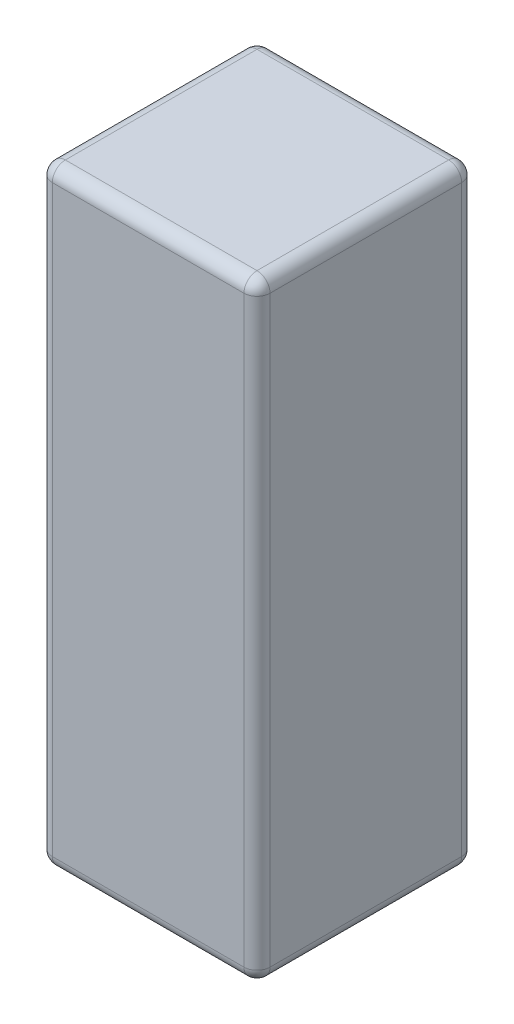
ISO-10303-21;
HEADER;
FILE_DESCRIPTION(('STEP AP214'),'2;1');
FILE_NAME('part.step','',(''),(''),'','','');
FILE_SCHEMA(('AUTOMOTIVE_DESIGN { 1 0 10303 214 1 1 1 1 }'));
ENDSEC;
DATA;
#1=APPLICATION_CONTEXT('core data for automotive mechanical design processes');
#2=APPLICATION_PROTOCOL_DEFINITION('international standard','automotive_design',2000,#1);
#3=PRODUCT_CONTEXT('',#1,'mechanical');
#4=PRODUCT('Part','Part','',(#3));
#5=PRODUCT_RELATED_PRODUCT_CATEGORY('part','',(#4));
#6=PRODUCT_DEFINITION_FORMATION('','',#4);
#7=PRODUCT_DEFINITION_CONTEXT('part definition',#1,'design');
#8=PRODUCT_DEFINITION('design','',#6,#7);
#9=PRODUCT_DEFINITION_SHAPE('','',#8);
#10=(LENGTH_UNIT() NAMED_UNIT(*) SI_UNIT(.MILLI.,.METRE.));
#11=(NAMED_UNIT(*) PLANE_ANGLE_UNIT() SI_UNIT($,.RADIAN.));
#12=(NAMED_UNIT(*) SI_UNIT($,.STERADIAN.) SOLID_ANGLE_UNIT());
#13=UNCERTAINTY_MEASURE_WITH_UNIT(LENGTH_MEASURE(1.E-05),#10,'distance_accuracy_value','');
#14=(GEOMETRIC_REPRESENTATION_CONTEXT(3) GLOBAL_UNCERTAINTY_ASSIGNED_CONTEXT((#13)) GLOBAL_UNIT_ASSIGNED_CONTEXT((#10,
#11,#12)) REPRESENTATION_CONTEXT('',''));
#15=CARTESIAN_POINT('',(0.,0.,0.));
#16=DIRECTION('',(0.,0.,1.));
#17=DIRECTION('',(1.,0.,0.));
#18=AXIS2_PLACEMENT_3D('',#15,#16,#17);
#19=CARTESIAN_POINT('',(0.,140.,0.));
#20=DIRECTION('',(1.,0.,0.));
#21=DIRECTION('',(0.,0.,-1.));
#22=AXIS2_PLACEMENT_3D('',#19,#20,#21);
#23=PLANE('',#22);
#24=DIRECTION('',(0.,-1.,0.));
#25=VECTOR('',#24,1.);
#26=CARTESIAN_POINT('',(0.,140.,-47.));
#27=LINE('',#26,#25);
#28=CARTESIAN_POINT('',(0.,137.,-47.));
#29=VERTEX_POINT('',#28);
#30=CARTESIAN_POINT('',(0.,3.,-47.));
#31=VERTEX_POINT('',#30);
#32=EDGE_CURVE('E190',#29,#31,#27,.T.);
#33=ORIENTED_EDGE('',*,*,#32,.T.);
#34=DIRECTION('',(0.,0.,1.));
#35=VECTOR('',#34,1.);
#36=CARTESIAN_POINT('',(0.,3.,0.));
#37=LINE('',#36,#35);
#38=CARTESIAN_POINT('',(0.,3.,-3.));
#39=VERTEX_POINT('',#38);
#40=EDGE_CURVE('E193',#31,#39,#37,.T.);
#41=ORIENTED_EDGE('',*,*,#40,.T.);
#42=DIRECTION('',(0.,-1.,0.));
#43=VECTOR('',#42,1.);
#44=CARTESIAN_POINT('',(0.,140.,-3.));
#45=LINE('',#44,#43);
#46=CARTESIAN_POINT('',(0.,137.,-3.));
#47=VERTEX_POINT('',#46);
#48=EDGE_CURVE('E188',#39,#47,#45,.F.);
#49=ORIENTED_EDGE('',*,*,#48,.T.);
#50=DIRECTION('',(0.,0.,1.));
#51=VECTOR('',#50,1.);
#52=CARTESIAN_POINT('',(0.,137.,0.));
#53=LINE('',#52,#51);
#54=EDGE_CURVE('E186',#47,#29,#53,.F.);
#55=ORIENTED_EDGE('',*,*,#54,.T.);
#56=EDGE_LOOP('',(#33,#41,#49,#55));
#57=FACE_BOUND('',#56,.T.);
#58=ADVANCED_FACE('F39',(#57),#23,.F.);
#59=CARTESIAN_POINT('',(0.,140.,0.));
#60=DIRECTION('',(0.,0.,-1.));
#61=DIRECTION('',(-1.,0.,0.));
#62=AXIS2_PLACEMENT_3D('',#59,#60,#61);
#63=PLANE('',#62);
#64=DIRECTION('',(0.,-1.,0.));
#65=VECTOR('',#64,1.);
#66=CARTESIAN_POINT('',(3.,140.,0.));
#67=LINE('',#66,#65);
#68=CARTESIAN_POINT('',(3.,137.,0.));
#69=VERTEX_POINT('',#68);
#70=CARTESIAN_POINT('',(3.,3.,0.));
#71=VERTEX_POINT('',#70);
#72=EDGE_CURVE('E172',#69,#71,#67,.T.);
#73=ORIENTED_EDGE('',*,*,#72,.T.);
#74=DIRECTION('',(1.,0.,0.));
#75=VECTOR('',#74,1.);
#76=CARTESIAN_POINT('',(50.,3.,0.));
#77=LINE('',#76,#75);
#78=CARTESIAN_POINT('',(47.,3.,0.));
#79=VERTEX_POINT('',#78);
#80=EDGE_CURVE('E177',#71,#79,#77,.T.);
#81=ORIENTED_EDGE('',*,*,#80,.T.);
#82=DIRECTION('',(0.,-1.,0.));
#83=VECTOR('',#82,1.);
#84=CARTESIAN_POINT('',(47.,140.,0.));
#85=LINE('',#84,#83);
#86=CARTESIAN_POINT('',(47.,137.,0.));
#87=VERTEX_POINT('',#86);
#88=EDGE_CURVE('E174',#79,#87,#85,.F.);
#89=ORIENTED_EDGE('',*,*,#88,.T.);
#90=DIRECTION('',(1.,0.,0.));
#91=VECTOR('',#90,1.);
#92=CARTESIAN_POINT('',(0.,137.,0.));
#93=LINE('',#92,#91);
#94=EDGE_CURVE('E170',#87,#69,#93,.F.);
#95=ORIENTED_EDGE('',*,*,#94,.T.);
#96=EDGE_LOOP('',(#73,#81,#89,#95));
#97=FACE_BOUND('',#96,.T.);
#98=ADVANCED_FACE('F311',(#97),#63,.F.);
#99=CARTESIAN_POINT('',(50.,140.,0.));
#100=DIRECTION('',(-1.,0.,0.));
#101=DIRECTION('',(0.,0.,1.));
#102=AXIS2_PLACEMENT_3D('',#99,#100,#101);
#103=PLANE('',#102);
#104=DIRECTION('',(0.,-1.,0.));
#105=VECTOR('',#104,1.);
#106=CARTESIAN_POINT('',(50.,140.,-3.));
#107=LINE('',#106,#105);
#108=CARTESIAN_POINT('',(50.,137.,-3.));
#109=VERTEX_POINT('',#108);
#110=CARTESIAN_POINT('',(50.,3.,-3.));
#111=VERTEX_POINT('',#110);
#112=EDGE_CURVE('E138',#109,#111,#107,.T.);
#113=ORIENTED_EDGE('',*,*,#112,.T.);
#114=DIRECTION('',(0.,0.,-1.));
#115=VECTOR('',#114,1.);
#116=CARTESIAN_POINT('',(50.,3.,-50.));
#117=LINE('',#116,#115);
#118=CARTESIAN_POINT('',(50.,3.,-47.));
#119=VERTEX_POINT('',#118);
#120=EDGE_CURVE('E134',#111,#119,#117,.T.);
#121=ORIENTED_EDGE('',*,*,#120,.T.);
#122=DIRECTION('',(0.,-1.,0.));
#123=VECTOR('',#122,1.);
#124=CARTESIAN_POINT('',(50.,140.,-47.));
#125=LINE('',#124,#123);
#126=CARTESIAN_POINT('',(50.,137.,-47.));
#127=VERTEX_POINT('',#126);
#128=EDGE_CURVE('E126',#119,#127,#125,.F.);
#129=ORIENTED_EDGE('',*,*,#128,.T.);
#130=DIRECTION('',(0.,0.,-1.));
#131=VECTOR('',#130,1.);
#132=CARTESIAN_POINT('',(50.,137.,0.));
#133=LINE('',#132,#131);
#134=EDGE_CURVE('E131',#127,#109,#133,.F.);
#135=ORIENTED_EDGE('',*,*,#134,.T.);
#136=EDGE_LOOP('',(#113,#121,#129,#135));
#137=FACE_BOUND('',#136,.T.);
#138=ADVANCED_FACE('F129',(#137),#103,.F.);
#139=CARTESIAN_POINT('',(0.,140.,-50.));
#140=DIRECTION('',(0.,0.,1.));
#141=DIRECTION('',(1.,0.,0.));
#142=AXIS2_PLACEMENT_3D('',#139,#140,#141);
#143=PLANE('',#142);
#144=DIRECTION('',(0.,-1.,0.));
#145=VECTOR('',#144,1.);
#146=CARTESIAN_POINT('',(47.,140.,-50.));
#147=LINE('',#146,#145);
#148=CARTESIAN_POINT('',(47.,137.,-50.));
#149=VERTEX_POINT('',#148);
#150=CARTESIAN_POINT('',(47.,3.,-50.));
#151=VERTEX_POINT('',#150);
#152=EDGE_CURVE('E146',#149,#151,#147,.T.);
#153=ORIENTED_EDGE('',*,*,#152,.T.);
#154=DIRECTION('',(-1.,0.,0.));
#155=VECTOR('',#154,1.);
#156=CARTESIAN_POINT('',(0.,3.,-50.));
#157=LINE('',#156,#155);
#158=CARTESIAN_POINT('',(3.,3.,-50.));
#159=VERTEX_POINT('',#158);
#160=EDGE_CURVE('E184',#151,#159,#157,.T.);
#161=ORIENTED_EDGE('',*,*,#160,.T.);
#162=DIRECTION('',(0.,-1.,0.));
#163=VECTOR('',#162,1.);
#164=CARTESIAN_POINT('',(3.,140.,-50.));
#165=LINE('',#164,#163);
#166=CARTESIAN_POINT('',(3.,137.,-50.));
#167=VERTEX_POINT('',#166);
#168=EDGE_CURVE('E181',#159,#167,#165,.F.);
#169=ORIENTED_EDGE('',*,*,#168,.T.);
#170=DIRECTION('',(-1.,0.,0.));
#171=VECTOR('',#170,1.);
#172=CARTESIAN_POINT('',(0.,137.,-50.));
#173=LINE('',#172,#171);
#174=EDGE_CURVE('E179',#167,#149,#173,.F.);
#175=ORIENTED_EDGE('',*,*,#174,.T.);
#176=EDGE_LOOP('',(#153,#161,#169,#175));
#177=FACE_BOUND('',#176,.T.);
#178=ADVANCED_FACE('F302',(#177),#143,.F.);
#179=CARTESIAN_POINT('',(0.,140.,0.));
#180=DIRECTION('',(0.,-1.,0.));
#181=DIRECTION('',(0.,0.,-1.));
#182=AXIS2_PLACEMENT_3D('',#179,#180,#181);
#183=PLANE('',#182);
#184=DIRECTION('',(0.,0.,-1.));
#185=VECTOR('',#184,1.);
#186=CARTESIAN_POINT('',(47.,140.,0.));
#187=LINE('',#186,#185);
#188=CARTESIAN_POINT('',(47.,140.,-3.));
#189=VERTEX_POINT('',#188);
#190=CARTESIAN_POINT('',(47.,140.,-47.));
#191=VERTEX_POINT('',#190);
#192=EDGE_CURVE('E48',#189,#191,#187,.T.);
#193=ORIENTED_EDGE('',*,*,#192,.T.);
#194=DIRECTION('',(-1.,0.,0.));
#195=VECTOR('',#194,1.);
#196=CARTESIAN_POINT('',(0.,140.,-47.));
#197=LINE('',#196,#195);
#198=CARTESIAN_POINT('',(3.,140.,-47.));
#199=VERTEX_POINT('',#198);
#200=EDGE_CURVE('E11',#191,#199,#197,.T.);
#201=ORIENTED_EDGE('',*,*,#200,.T.);
#202=DIRECTION('',(0.,0.,1.));
#203=VECTOR('',#202,1.);
#204=CARTESIAN_POINT('',(3.,140.,0.));
#205=LINE('',#204,#203);
#206=CARTESIAN_POINT('',(3.,140.,-3.));
#207=VERTEX_POINT('',#206);
#208=EDGE_CURVE('E204',#199,#207,#205,.T.);
#209=ORIENTED_EDGE('',*,*,#208,.T.);
#210=DIRECTION('',(1.,0.,0.));
#211=VECTOR('',#210,1.);
#212=CARTESIAN_POINT('',(0.,140.,-3.));
#213=LINE('',#212,#211);
#214=EDGE_CURVE('E59',#207,#189,#213,.T.);
#215=ORIENTED_EDGE('',*,*,#214,.T.);
#216=EDGE_LOOP('',(#193,#201,#209,#215));
#217=FACE_BOUND('',#216,.T.);
#218=ADVANCED_FACE('F304',(#217),#183,.F.);
#219=CARTESIAN_POINT('',(0.,0.,0.));
#220=DIRECTION('',(0.,-1.,0.));
#221=DIRECTION('',(0.,0.,-1.));
#222=AXIS2_PLACEMENT_3D('',#219,#220,#221);
#223=PLANE('',#222);
#224=DIRECTION('',(0.,0.,-1.));
#225=VECTOR('',#224,1.);
#226=CARTESIAN_POINT('',(47.,0.,0.));
#227=LINE('',#226,#225);
#228=CARTESIAN_POINT('',(47.,0.,-47.));
#229=VERTEX_POINT('',#228);
#230=CARTESIAN_POINT('',(47.,0.,-3.));
#231=VERTEX_POINT('',#230);
#232=EDGE_CURVE('E199',#229,#231,#227,.F.);
#233=ORIENTED_EDGE('',*,*,#232,.T.);
#234=DIRECTION('',(1.,0.,0.));
#235=VECTOR('',#234,1.);
#236=CARTESIAN_POINT('',(0.,0.,-3.));
#237=LINE('',#236,#235);
#238=CARTESIAN_POINT('',(3.,0.,-3.));
#239=VERTEX_POINT('',#238);
#240=EDGE_CURVE('E201',#231,#239,#237,.F.);
#241=ORIENTED_EDGE('',*,*,#240,.T.);
#242=DIRECTION('',(0.,0.,1.));
#243=VECTOR('',#242,1.);
#244=CARTESIAN_POINT('',(3.,0.,-50.));
#245=LINE('',#244,#243);
#246=CARTESIAN_POINT('',(3.,0.,-47.));
#247=VERTEX_POINT('',#246);
#248=EDGE_CURVE('E195',#239,#247,#245,.F.);
#249=ORIENTED_EDGE('',*,*,#248,.T.);
#250=DIRECTION('',(-1.,0.,0.));
#251=VECTOR('',#250,1.);
#252=CARTESIAN_POINT('',(50.,0.,-47.));
#253=LINE('',#252,#251);
#254=EDGE_CURVE('E197',#247,#229,#253,.F.);
#255=ORIENTED_EDGE('',*,*,#254,.T.);
#256=EDGE_LOOP('',(#233,#241,#249,#255));
#257=FACE_BOUND('',#256,.T.);
#258=ADVANCED_FACE('F271',(#257),#223,.T.);
#259=CARTESIAN_POINT('',(3.,140.,-47.));
#260=DIRECTION('',(0.,-1.,0.));
#261=DIRECTION('',(0.,0.,-1.));
#262=AXIS2_PLACEMENT_3D('',#259,#260,#261);
#263=CYLINDRICAL_SURFACE('',#262,3.);
#264=CARTESIAN_POINT('',(3.,137.,-47.));
#265=DIRECTION('',(0.,1.,0.));
#266=DIRECTION('',(0.,0.,1.));
#267=AXIS2_PLACEMENT_3D('',#264,#265,#266);
#268=CIRCLE('',#267,3.);
#269=EDGE_CURVE('E43',#167,#29,#268,.T.);
#270=ORIENTED_EDGE('',*,*,#269,.F.);
#271=ORIENTED_EDGE('',*,*,#168,.F.);
#272=CARTESIAN_POINT('',(3.,3.,-47.));
#273=DIRECTION('',(0.,-1.,0.));
#274=DIRECTION('',(0.,0.,-1.));
#275=AXIS2_PLACEMENT_3D('',#272,#273,#274);
#276=CIRCLE('',#275,3.);
#277=EDGE_CURVE('E166',#31,#159,#276,.T.);
#278=ORIENTED_EDGE('',*,*,#277,.F.);
#279=ORIENTED_EDGE('',*,*,#32,.F.);
#280=EDGE_LOOP('',(#270,#271,#278,#279));
#281=FACE_BOUND('',#280,.T.);
#282=ADVANCED_FACE('F41',(#281),#263,.T.);
#283=CARTESIAN_POINT('',(3.,137.,-47.));
#284=DIRECTION('',(-1.,0.,0.));
#285=DIRECTION('',(0.,0.,1.));
#286=AXIS2_PLACEMENT_3D('',#283,#284,#285);
#287=SPHERICAL_SURFACE('',#286,3.);
#288=CARTESIAN_POINT('',(3.,137.,-47.));
#289=DIRECTION('',(-1.,0.,0.));
#290=DIRECTION('',(0.,0.,1.));
#291=AXIS2_PLACEMENT_3D('',#288,#289,#290);
#292=CIRCLE('',#291,3.);
#293=EDGE_CURVE('E250',#167,#199,#292,.F.);
#294=ORIENTED_EDGE('',*,*,#293,.F.);
#295=ORIENTED_EDGE('',*,*,#269,.T.);
#296=CARTESIAN_POINT('',(3.,137.,-47.));
#297=DIRECTION('',(0.,0.,-1.));
#298=DIRECTION('',(-1.,0.,0.));
#299=AXIS2_PLACEMENT_3D('',#296,#297,#298);
#300=CIRCLE('',#299,3.);
#301=EDGE_CURVE('E253',#199,#29,#300,.F.);
#302=ORIENTED_EDGE('',*,*,#301,.F.);
#303=EDGE_LOOP('',(#294,#295,#302));
#304=FACE_BOUND('',#303,.T.);
#305=ADVANCED_FACE('F297',(#304),#287,.T.);
#306=CARTESIAN_POINT('',(3.,3.,-47.));
#307=DIRECTION('',(0.,0.,-1.));
#308=DIRECTION('',(0.,1.,0.));
#309=AXIS2_PLACEMENT_3D('',#306,#307,#308);
#310=SPHERICAL_SURFACE('',#309,3.);
#311=CARTESIAN_POINT('',(3.,3.,-47.));
#312=DIRECTION('',(0.,0.,-1.));
#313=DIRECTION('',(-1.,0.,0.));
#314=AXIS2_PLACEMENT_3D('',#311,#312,#313);
#315=CIRCLE('',#314,3.);
#316=EDGE_CURVE('E244',#31,#247,#315,.F.);
#317=ORIENTED_EDGE('',*,*,#316,.F.);
#318=ORIENTED_EDGE('',*,*,#277,.T.);
#319=CARTESIAN_POINT('',(3.,3.,-47.));
#320=DIRECTION('',(-1.,0.,0.));
#321=DIRECTION('',(0.,0.,1.));
#322=AXIS2_PLACEMENT_3D('',#319,#320,#321);
#323=CIRCLE('',#322,3.);
#324=EDGE_CURVE('E247',#247,#159,#323,.F.);
#325=ORIENTED_EDGE('',*,*,#324,.F.);
#326=EDGE_LOOP('',(#317,#318,#325));
#327=FACE_BOUND('',#326,.T.);
#328=ADVANCED_FACE('F260',(#327),#310,.T.);
#329=CARTESIAN_POINT('',(3.,137.,0.));
#330=DIRECTION('',(0.,0.,1.));
#331=DIRECTION('',(1.,0.,0.));
#332=AXIS2_PLACEMENT_3D('',#329,#330,#331);
#333=CYLINDRICAL_SURFACE('',#332,3.);
#334=ORIENTED_EDGE('',*,*,#301,.T.);
#335=ORIENTED_EDGE('',*,*,#54,.F.);
#336=CARTESIAN_POINT('',(3.,137.,-3.));
#337=DIRECTION('',(0.,0.,1.));
#338=DIRECTION('',(1.,0.,0.));
#339=AXIS2_PLACEMENT_3D('',#336,#337,#338);
#340=CIRCLE('',#339,3.);
#341=EDGE_CURVE('E238',#207,#47,#340,.T.);
#342=ORIENTED_EDGE('',*,*,#341,.F.);
#343=ORIENTED_EDGE('',*,*,#208,.F.);
#344=EDGE_LOOP('',(#334,#335,#342,#343));
#345=FACE_BOUND('',#344,.T.);
#346=ADVANCED_FACE('F292',(#345),#333,.T.);
#347=CARTESIAN_POINT('',(0.,137.,-47.));
#348=DIRECTION('',(-1.,0.,0.));
#349=DIRECTION('',(0.,0.,1.));
#350=AXIS2_PLACEMENT_3D('',#347,#348,#349);
#351=CYLINDRICAL_SURFACE('',#350,3.);
#352=ORIENTED_EDGE('',*,*,#293,.T.);
#353=ORIENTED_EDGE('',*,*,#200,.F.);
#354=CARTESIAN_POINT('',(47.,137.,-47.));
#355=DIRECTION('',(1.,0.,0.));
#356=DIRECTION('',(0.,0.,-1.));
#357=AXIS2_PLACEMENT_3D('',#354,#355,#356);
#358=CIRCLE('',#357,3.);
#359=EDGE_CURVE('E150',#149,#191,#358,.T.);
#360=ORIENTED_EDGE('',*,*,#359,.F.);
#361=ORIENTED_EDGE('',*,*,#174,.F.);
#362=EDGE_LOOP('',(#352,#353,#360,#361));
#363=FACE_BOUND('',#362,.T.);
#364=ADVANCED_FACE('F300',(#363),#351,.T.);
#365=CARTESIAN_POINT('',(47.,140.,-47.));
#366=DIRECTION('',(0.,-1.,0.));
#367=DIRECTION('',(0.,0.,-1.));
#368=AXIS2_PLACEMENT_3D('',#365,#366,#367);
#369=CYLINDRICAL_SURFACE('',#368,3.);
#370=CARTESIAN_POINT('',(47.,3.,-47.));
#371=DIRECTION('',(0.,-1.,0.));
#372=DIRECTION('',(0.,0.,-1.));
#373=AXIS2_PLACEMENT_3D('',#370,#371,#372);
#374=CIRCLE('',#373,3.);
#375=EDGE_CURVE('E151',#151,#119,#374,.T.);
#376=ORIENTED_EDGE('',*,*,#375,.F.);
#377=ORIENTED_EDGE('',*,*,#152,.F.);
#378=CARTESIAN_POINT('',(47.,137.,-47.));
#379=DIRECTION('',(0.,1.,0.));
#380=DIRECTION('',(0.,0.,1.));
#381=AXIS2_PLACEMENT_3D('',#378,#379,#380);
#382=CIRCLE('',#381,3.);
#383=EDGE_CURVE('E142',#127,#149,#382,.T.);
#384=ORIENTED_EDGE('',*,*,#383,.F.);
#385=ORIENTED_EDGE('',*,*,#128,.F.);
#386=EDGE_LOOP('',(#376,#377,#384,#385));
#387=FACE_BOUND('',#386,.T.);
#388=ADVANCED_FACE('F144',(#387),#369,.T.);
#389=CARTESIAN_POINT('',(0.,3.,-47.));
#390=DIRECTION('',(1.,0.,0.));
#391=DIRECTION('',(0.,0.,-1.));
#392=AXIS2_PLACEMENT_3D('',#389,#390,#391);
#393=CYLINDRICAL_SURFACE('',#392,3.);
#394=ORIENTED_EDGE('',*,*,#324,.T.);
#395=ORIENTED_EDGE('',*,*,#160,.F.);
#396=CARTESIAN_POINT('',(47.,3.,-47.));
#397=DIRECTION('',(1.,0.,0.));
#398=DIRECTION('',(0.,0.,-1.));
#399=AXIS2_PLACEMENT_3D('',#396,#397,#398);
#400=CIRCLE('',#399,3.);
#401=EDGE_CURVE('E234',#229,#151,#400,.T.);
#402=ORIENTED_EDGE('',*,*,#401,.F.);
#403=ORIENTED_EDGE('',*,*,#254,.F.);
#404=EDGE_LOOP('',(#394,#395,#402,#403));
#405=FACE_BOUND('',#404,.T.);
#406=ADVANCED_FACE('F267',(#405),#393,.T.);
#407=CARTESIAN_POINT('',(3.,3.,0.));
#408=DIRECTION('',(0.,0.,-1.));
#409=DIRECTION('',(-1.,0.,0.));
#410=AXIS2_PLACEMENT_3D('',#407,#408,#409);
#411=CYLINDRICAL_SURFACE('',#410,3.);
#412=ORIENTED_EDGE('',*,*,#316,.T.);
#413=ORIENTED_EDGE('',*,*,#248,.F.);
#414=CARTESIAN_POINT('',(3.,3.,-3.));
#415=DIRECTION('',(0.,0.,1.));
#416=DIRECTION('',(1.,0.,0.));
#417=AXIS2_PLACEMENT_3D('',#414,#415,#416);
#418=CIRCLE('',#417,3.);
#419=EDGE_CURVE('E231',#39,#239,#418,.T.);
#420=ORIENTED_EDGE('',*,*,#419,.F.);
#421=ORIENTED_EDGE('',*,*,#40,.F.);
#422=EDGE_LOOP('',(#412,#413,#420,#421));
#423=FACE_BOUND('',#422,.T.);
#424=ADVANCED_FACE('F277',(#423),#411,.T.);
#425=CARTESIAN_POINT('',(3.,140.,-3.));
#426=DIRECTION('',(0.,-1.,0.));
#427=DIRECTION('',(0.,0.,-1.));
#428=AXIS2_PLACEMENT_3D('',#425,#426,#427);
#429=CYLINDRICAL_SURFACE('',#428,3.);
#430=CARTESIAN_POINT('',(3.,137.,-3.));
#431=DIRECTION('',(0.,1.,0.));
#432=DIRECTION('',(0.,0.,1.));
#433=AXIS2_PLACEMENT_3D('',#430,#431,#432);
#434=CIRCLE('',#433,3.);
#435=EDGE_CURVE('E241',#47,#69,#434,.T.);
#436=ORIENTED_EDGE('',*,*,#435,.F.);
#437=ORIENTED_EDGE('',*,*,#48,.F.);
#438=CARTESIAN_POINT('',(3.,3.,-3.));
#439=DIRECTION('',(0.,-1.,0.));
#440=DIRECTION('',(0.,0.,-1.));
#441=AXIS2_PLACEMENT_3D('',#438,#439,#440);
#442=CIRCLE('',#441,3.);
#443=EDGE_CURVE('E228',#71,#39,#442,.T.);
#444=ORIENTED_EDGE('',*,*,#443,.F.);
#445=ORIENTED_EDGE('',*,*,#72,.F.);
#446=EDGE_LOOP('',(#436,#437,#444,#445));
#447=FACE_BOUND('',#446,.T.);
#448=ADVANCED_FACE('F284',(#447),#429,.T.);
#449=CARTESIAN_POINT('',(3.,137.,-3.));
#450=DIRECTION('',(-1.,0.,0.));
#451=DIRECTION('',(0.,0.,1.));
#452=AXIS2_PLACEMENT_3D('',#449,#450,#451);
#453=SPHERICAL_SURFACE('',#452,3.);
#454=ORIENTED_EDGE('',*,*,#341,.T.);
#455=ORIENTED_EDGE('',*,*,#435,.T.);
#456=CARTESIAN_POINT('',(3.,137.,-3.));
#457=DIRECTION('',(-1.,0.,0.));
#458=DIRECTION('',(0.,0.,1.));
#459=AXIS2_PLACEMENT_3D('',#456,#457,#458);
#460=CIRCLE('',#459,3.);
#461=EDGE_CURVE('E157',#207,#69,#460,.F.);
#462=ORIENTED_EDGE('',*,*,#461,.F.);
#463=EDGE_LOOP('',(#454,#455,#462));
#464=FACE_BOUND('',#463,.T.);
#465=ADVANCED_FACE('F290',(#464),#453,.T.);
#466=CARTESIAN_POINT('',(47.,137.,-47.));
#467=DIRECTION('',(0.,0.,-1.));
#468=DIRECTION('',(-1.,0.,0.));
#469=AXIS2_PLACEMENT_3D('',#466,#467,#468);
#470=SPHERICAL_SURFACE('',#469,3.);
#471=ORIENTED_EDGE('',*,*,#383,.T.);
#472=ORIENTED_EDGE('',*,*,#359,.T.);
#473=CARTESIAN_POINT('',(47.,137.,-47.));
#474=DIRECTION('',(0.,0.,-1.));
#475=DIRECTION('',(-1.,0.,0.));
#476=AXIS2_PLACEMENT_3D('',#473,#474,#475);
#477=CIRCLE('',#476,3.);
#478=EDGE_CURVE('E154',#127,#191,#477,.F.);
#479=ORIENTED_EDGE('',*,*,#478,.F.);
#480=EDGE_LOOP('',(#471,#472,#479));
#481=FACE_BOUND('',#480,.T.);
#482=ADVANCED_FACE('F155',(#481),#470,.T.);
#483=CARTESIAN_POINT('',(47.,3.,-47.));
#484=DIRECTION('',(0.,0.,-1.));
#485=DIRECTION('',(0.,1.,0.));
#486=AXIS2_PLACEMENT_3D('',#483,#484,#485);
#487=SPHERICAL_SURFACE('',#486,3.);
#488=ORIENTED_EDGE('',*,*,#401,.T.);
#489=ORIENTED_EDGE('',*,*,#375,.T.);
#490=CARTESIAN_POINT('',(47.,3.,-47.));
#491=DIRECTION('',(0.,0.,-1.));
#492=DIRECTION('',(-1.,0.,0.));
#493=AXIS2_PLACEMENT_3D('',#490,#491,#492);
#494=CIRCLE('',#493,3.);
#495=EDGE_CURVE('E158',#229,#119,#494,.F.);
#496=ORIENTED_EDGE('',*,*,#495,.F.);
#497=EDGE_LOOP('',(#488,#489,#496));
#498=FACE_BOUND('',#497,.T.);
#499=ADVANCED_FACE('F351',(#498),#487,.T.);
#500=CARTESIAN_POINT('',(3.,3.,-3.));
#501=DIRECTION('',(-1.,0.,0.));
#502=DIRECTION('',(0.,-1.,0.));
#503=AXIS2_PLACEMENT_3D('',#500,#501,#502);
#504=SPHERICAL_SURFACE('',#503,3.);
#505=ORIENTED_EDGE('',*,*,#443,.T.);
#506=ORIENTED_EDGE('',*,*,#419,.T.);
#507=CARTESIAN_POINT('',(3.,3.,-3.));
#508=DIRECTION('',(-1.,0.,0.));
#509=DIRECTION('',(0.,0.,1.));
#510=AXIS2_PLACEMENT_3D('',#507,#508,#509);
#511=CIRCLE('',#510,3.);
#512=EDGE_CURVE('E222',#71,#239,#511,.F.);
#513=ORIENTED_EDGE('',*,*,#512,.F.);
#514=EDGE_LOOP('',(#505,#506,#513));
#515=FACE_BOUND('',#514,.T.);
#516=ADVANCED_FACE('F347',(#515),#504,.T.);
#517=CARTESIAN_POINT('',(0.,137.,-3.));
#518=DIRECTION('',(1.,0.,0.));
#519=DIRECTION('',(0.,0.,-1.));
#520=AXIS2_PLACEMENT_3D('',#517,#518,#519);
#521=CYLINDRICAL_SURFACE('',#520,3.);
#522=ORIENTED_EDGE('',*,*,#461,.T.);
#523=ORIENTED_EDGE('',*,*,#94,.F.);
#524=CARTESIAN_POINT('',(47.,137.,-3.));
#525=DIRECTION('',(1.,0.,0.));
#526=DIRECTION('',(0.,0.,-1.));
#527=AXIS2_PLACEMENT_3D('',#524,#525,#526);
#528=CIRCLE('',#527,3.);
#529=EDGE_CURVE('E219',#189,#87,#528,.T.);
#530=ORIENTED_EDGE('',*,*,#529,.F.);
#531=ORIENTED_EDGE('',*,*,#214,.F.);
#532=EDGE_LOOP('',(#522,#523,#530,#531));
#533=FACE_BOUND('',#532,.T.);
#534=ADVANCED_FACE('F344',(#533),#521,.T.);
#535=CARTESIAN_POINT('',(47.,137.,0.));
#536=DIRECTION('',(0.,0.,-1.));
#537=DIRECTION('',(-1.,0.,0.));
#538=AXIS2_PLACEMENT_3D('',#535,#536,#537);
#539=CYLINDRICAL_SURFACE('',#538,3.);
#540=ORIENTED_EDGE('',*,*,#478,.T.);
#541=ORIENTED_EDGE('',*,*,#192,.F.);
#542=CARTESIAN_POINT('',(47.,137.,-3.));
#543=DIRECTION('',(0.,0.,1.));
#544=DIRECTION('',(1.,0.,0.));
#545=AXIS2_PLACEMENT_3D('',#542,#543,#544);
#546=CIRCLE('',#545,3.);
#547=EDGE_CURVE('E162',#109,#189,#546,.T.);
#548=ORIENTED_EDGE('',*,*,#547,.F.);
#549=ORIENTED_EDGE('',*,*,#134,.F.);
#550=EDGE_LOOP('',(#540,#541,#548,#549));
#551=FACE_BOUND('',#550,.T.);
#552=ADVANCED_FACE('F160',(#551),#539,.T.);
#553=CARTESIAN_POINT('',(47.,3.,0.));
#554=DIRECTION('',(0.,0.,1.));
#555=DIRECTION('',(1.,0.,0.));
#556=AXIS2_PLACEMENT_3D('',#553,#554,#555);
#557=CYLINDRICAL_SURFACE('',#556,3.);
#558=ORIENTED_EDGE('',*,*,#495,.T.);
#559=ORIENTED_EDGE('',*,*,#120,.F.);
#560=CARTESIAN_POINT('',(47.,3.,-3.));
#561=DIRECTION('',(0.,0.,1.));
#562=DIRECTION('',(1.,0.,0.));
#563=AXIS2_PLACEMENT_3D('',#560,#561,#562);
#564=CIRCLE('',#563,3.);
#565=EDGE_CURVE('E215',#231,#111,#564,.T.);
#566=ORIENTED_EDGE('',*,*,#565,.F.);
#567=ORIENTED_EDGE('',*,*,#232,.F.);
#568=EDGE_LOOP('',(#558,#559,#566,#567));
#569=FACE_BOUND('',#568,.T.);
#570=ADVANCED_FACE('F337',(#569),#557,.T.);
#571=CARTESIAN_POINT('',(0.,3.,-3.));
#572=DIRECTION('',(-1.,0.,0.));
#573=DIRECTION('',(0.,0.,1.));
#574=AXIS2_PLACEMENT_3D('',#571,#572,#573);
#575=CYLINDRICAL_SURFACE('',#574,3.);
#576=ORIENTED_EDGE('',*,*,#512,.T.);
#577=ORIENTED_EDGE('',*,*,#240,.F.);
#578=CARTESIAN_POINT('',(47.,3.,-3.));
#579=DIRECTION('',(1.,0.,0.));
#580=DIRECTION('',(0.,0.,-1.));
#581=AXIS2_PLACEMENT_3D('',#578,#579,#580);
#582=CIRCLE('',#581,3.);
#583=EDGE_CURVE('E212',#79,#231,#582,.T.);
#584=ORIENTED_EDGE('',*,*,#583,.F.);
#585=ORIENTED_EDGE('',*,*,#80,.F.);
#586=EDGE_LOOP('',(#576,#577,#584,#585));
#587=FACE_BOUND('',#586,.T.);
#588=ADVANCED_FACE('F333',(#587),#575,.T.);
#589=CARTESIAN_POINT('',(47.,137.,-3.));
#590=DIRECTION('',(0.,1.,0.));
#591=DIRECTION('',(0.,0.,1.));
#592=AXIS2_PLACEMENT_3D('',#589,#590,#591);
#593=SPHERICAL_SURFACE('',#592,3.);
#594=ORIENTED_EDGE('',*,*,#547,.T.);
#595=ORIENTED_EDGE('',*,*,#529,.T.);
#596=CARTESIAN_POINT('',(47.,137.,-3.));
#597=DIRECTION('',(0.,1.,0.));
#598=DIRECTION('',(0.,0.,1.));
#599=AXIS2_PLACEMENT_3D('',#596,#597,#598);
#600=CIRCLE('',#599,3.);
#601=EDGE_CURVE('E210',#109,#87,#600,.F.);
#602=ORIENTED_EDGE('',*,*,#601,.F.);
#603=EDGE_LOOP('',(#594,#595,#602));
#604=FACE_BOUND('',#603,.T.);
#605=ADVANCED_FACE('F329',(#604),#593,.T.);
#606=CARTESIAN_POINT('',(47.,3.,-3.));
#607=DIRECTION('',(0.,-1.,0.));
#608=DIRECTION('',(0.,0.,-1.));
#609=AXIS2_PLACEMENT_3D('',#606,#607,#608);
#610=SPHERICAL_SURFACE('',#609,3.);
#611=ORIENTED_EDGE('',*,*,#583,.T.);
#612=ORIENTED_EDGE('',*,*,#565,.T.);
#613=CARTESIAN_POINT('',(47.,3.,-3.));
#614=DIRECTION('',(0.,-1.,0.));
#615=DIRECTION('',(0.,0.,-1.));
#616=AXIS2_PLACEMENT_3D('',#613,#614,#615);
#617=CIRCLE('',#616,3.);
#618=EDGE_CURVE('E208',#79,#111,#617,.F.);
#619=ORIENTED_EDGE('',*,*,#618,.F.);
#620=EDGE_LOOP('',(#611,#612,#619));
#621=FACE_BOUND('',#620,.T.);
#622=ADVANCED_FACE('F325',(#621),#610,.T.);
#623=CARTESIAN_POINT('',(47.,140.,-3.));
#624=DIRECTION('',(0.,-1.,0.));
#625=DIRECTION('',(0.,0.,-1.));
#626=AXIS2_PLACEMENT_3D('',#623,#624,#625);
#627=CYLINDRICAL_SURFACE('',#626,3.);
#628=ORIENTED_EDGE('',*,*,#601,.T.);
#629=ORIENTED_EDGE('',*,*,#88,.F.);
#630=ORIENTED_EDGE('',*,*,#618,.T.);
#631=ORIENTED_EDGE('',*,*,#112,.F.);
#632=EDGE_LOOP('',(#628,#629,#630,#631));
#633=FACE_BOUND('',#632,.T.);
#634=ADVANCED_FACE('F322',(#633),#627,.T.);
#635=CLOSED_SHELL('',(#58,#98,#138,#178,#218,#258,#282,#305,#328,#346,#364,#388,#406,#424,#448,
#465,#482,#499,#516,#534,#552,#570,#588,#605,#622,#634));
#636=MANIFOLD_SOLID_BREP('B2',#635);
#637=ADVANCED_BREP_SHAPE_REPRESENTATION('',(#18,#636),#14);
#638=SHAPE_DEFINITION_REPRESENTATION(#9,#637);
ENDSEC;
END-ISO-10303-21;
